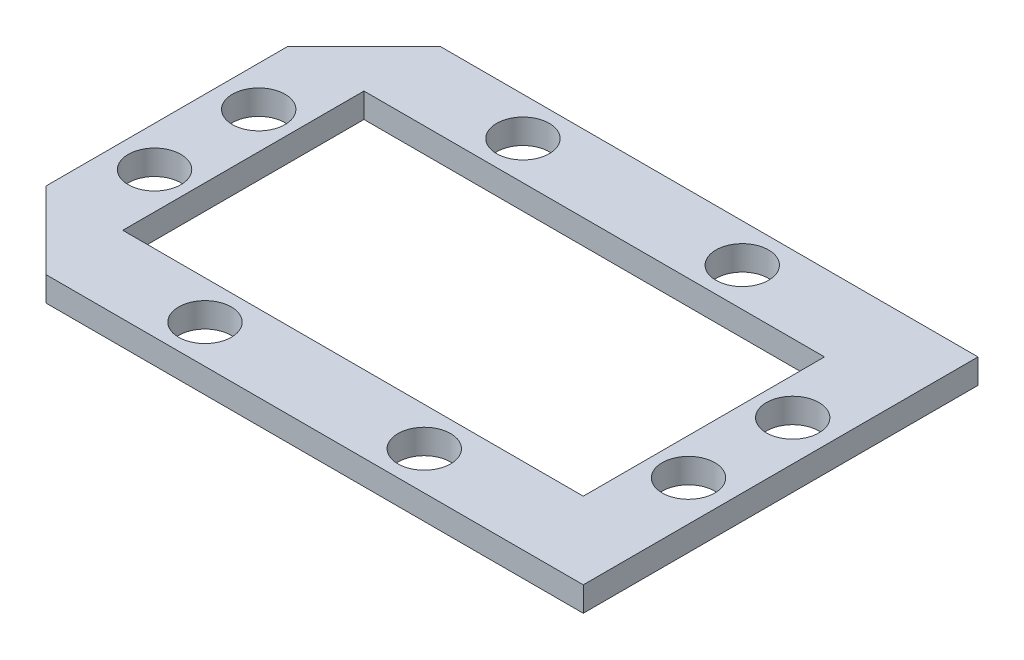
ISO-10303-21;
HEADER;
FILE_DESCRIPTION(('STEP AP214'),'2;1');
FILE_NAME('part.step','',(''),(''),'','','');
FILE_SCHEMA(('AUTOMOTIVE_DESIGN { 1 0 10303 214 1 1 1 1 }'));
ENDSEC;
DATA;
#1=APPLICATION_CONTEXT('core data for automotive mechanical design processes');
#2=APPLICATION_PROTOCOL_DEFINITION('international standard','automotive_design',2000,#1);
#3=PRODUCT_CONTEXT('',#1,'mechanical');
#4=PRODUCT('Part','Part','',(#3));
#5=PRODUCT_RELATED_PRODUCT_CATEGORY('part','',(#4));
#6=PRODUCT_DEFINITION_FORMATION('','',#4);
#7=PRODUCT_DEFINITION_CONTEXT('part definition',#1,'design');
#8=PRODUCT_DEFINITION('design','',#6,#7);
#9=PRODUCT_DEFINITION_SHAPE('','',#8);
#10=(LENGTH_UNIT() NAMED_UNIT(*) SI_UNIT(.MILLI.,.METRE.));
#11=(NAMED_UNIT(*) PLANE_ANGLE_UNIT() SI_UNIT($,.RADIAN.));
#12=(NAMED_UNIT(*) SI_UNIT($,.STERADIAN.) SOLID_ANGLE_UNIT());
#13=UNCERTAINTY_MEASURE_WITH_UNIT(LENGTH_MEASURE(1.E-05),#10,'distance_accuracy_value','');
#14=(GEOMETRIC_REPRESENTATION_CONTEXT(3) GLOBAL_UNCERTAINTY_ASSIGNED_CONTEXT((#13)) GLOBAL_UNIT_ASSIGNED_CONTEXT((#10,
#11,#12)) REPRESENTATION_CONTEXT('',''));
#15=CARTESIAN_POINT('',(0.,0.,0.));
#16=DIRECTION('',(0.,0.,1.));
#17=DIRECTION('',(1.,0.,0.));
#18=AXIS2_PLACEMENT_3D('',#15,#16,#17);
#19=CARTESIAN_POINT('',(0.,2.25,-18.));
#20=DIRECTION('',(0.,0.,-1.));
#21=DIRECTION('',(-1.,0.,0.));
#22=AXIS2_PLACEMENT_3D('',#19,#20,#21);
#23=PLANE('',#22);
#24=DIRECTION('',(1.,0.,0.));
#25=VECTOR('',#24,1.);
#26=CARTESIAN_POINT('',(0.,0.,-18.));
#27=LINE('',#26,#25);
#28=CARTESIAN_POINT('',(-21.,0.,-18.));
#29=VERTEX_POINT('',#28);
#30=CARTESIAN_POINT('',(28.,0.,-18.));
#31=VERTEX_POINT('',#30);
#32=EDGE_CURVE('E136',#29,#31,#27,.T.);
#33=ORIENTED_EDGE('',*,*,#32,.F.);
#34=DIRECTION('',(0.,1.,0.));
#35=VECTOR('',#34,1.);
#36=CARTESIAN_POINT('',(-21.,0.,-18.));
#37=LINE('',#36,#35);
#38=CARTESIAN_POINT('',(-21.,2.25,-18.));
#39=VERTEX_POINT('',#38);
#40=EDGE_CURVE('E60',#29,#39,#37,.T.);
#41=ORIENTED_EDGE('',*,*,#40,.T.);
#42=DIRECTION('',(1.,0.,0.));
#43=VECTOR('',#42,1.);
#44=CARTESIAN_POINT('',(0.,2.25,-18.));
#45=LINE('',#44,#43);
#46=CARTESIAN_POINT('',(28.,2.25,-18.));
#47=VERTEX_POINT('',#46);
#48=EDGE_CURVE('E257',#39,#47,#45,.T.);
#49=ORIENTED_EDGE('',*,*,#48,.T.);
#50=DIRECTION('',(0.,-1.,0.));
#51=VECTOR('',#50,1.);
#52=CARTESIAN_POINT('',(28.,2.25,-18.));
#53=LINE('',#52,#51);
#54=EDGE_CURVE('E11',#47,#31,#53,.T.);
#55=ORIENTED_EDGE('',*,*,#54,.T.);
#56=EDGE_LOOP('',(#33,#41,#49,#55));
#57=FACE_BOUND('',#56,.T.);
#58=ADVANCED_FACE('F37',(#57),#23,.T.);
#59=CARTESIAN_POINT('',(-28.,2.25,0.));
#60=DIRECTION('',(1.,0.,0.));
#61=DIRECTION('',(0.,0.,-1.));
#62=AXIS2_PLACEMENT_3D('',#59,#60,#61);
#63=PLANE('',#62);
#64=DIRECTION('',(0.,1.,0.));
#65=VECTOR('',#64,1.);
#66=CARTESIAN_POINT('',(-28.,0.,-11.));
#67=LINE('',#66,#65);
#68=CARTESIAN_POINT('',(-28.,0.,-11.));
#69=VERTEX_POINT('',#68);
#70=CARTESIAN_POINT('',(-28.,2.25,-11.));
#71=VERTEX_POINT('',#70);
#72=EDGE_CURVE('E116',#69,#71,#67,.T.);
#73=ORIENTED_EDGE('',*,*,#72,.F.);
#74=DIRECTION('',(0.,0.,1.));
#75=VECTOR('',#74,1.);
#76=CARTESIAN_POINT('',(-28.,0.,0.));
#77=LINE('',#76,#75);
#78=CARTESIAN_POINT('',(-28.,0.,11.));
#79=VERTEX_POINT('',#78);
#80=EDGE_CURVE('E128',#69,#79,#77,.T.);
#81=ORIENTED_EDGE('',*,*,#80,.T.);
#82=DIRECTION('',(0.,1.,0.));
#83=VECTOR('',#82,1.);
#84=CARTESIAN_POINT('',(-28.,0.,11.));
#85=LINE('',#84,#83);
#86=CARTESIAN_POINT('',(-28.,2.25,11.));
#87=VERTEX_POINT('',#86);
#88=EDGE_CURVE('E63',#79,#87,#85,.T.);
#89=ORIENTED_EDGE('',*,*,#88,.T.);
#90=DIRECTION('',(0.,0.,1.));
#91=VECTOR('',#90,1.);
#92=CARTESIAN_POINT('',(-28.,2.25,0.));
#93=LINE('',#92,#91);
#94=EDGE_CURVE('E135',#71,#87,#93,.T.);
#95=ORIENTED_EDGE('',*,*,#94,.F.);
#96=EDGE_LOOP('',(#73,#81,#89,#95));
#97=FACE_BOUND('',#96,.T.);
#98=ADVANCED_FACE('F129',(#97),#63,.F.);
#99=CARTESIAN_POINT('',(0.,2.25,18.));
#100=DIRECTION('',(0.,0.,-1.));
#101=DIRECTION('',(-1.,0.,0.));
#102=AXIS2_PLACEMENT_3D('',#99,#100,#101);
#103=PLANE('',#102);
#104=DIRECTION('',(0.,1.,0.));
#105=VECTOR('',#104,1.);
#106=CARTESIAN_POINT('',(-21.,0.,18.));
#107=LINE('',#106,#105);
#108=CARTESIAN_POINT('',(-21.,0.,18.));
#109=VERTEX_POINT('',#108);
#110=CARTESIAN_POINT('',(-21.,2.25,18.));
#111=VERTEX_POINT('',#110);
#112=EDGE_CURVE('E219',#109,#111,#107,.T.);
#113=ORIENTED_EDGE('',*,*,#112,.F.);
#114=DIRECTION('',(1.,0.,0.));
#115=VECTOR('',#114,1.);
#116=CARTESIAN_POINT('',(0.,0.,18.));
#117=LINE('',#116,#115);
#118=CARTESIAN_POINT('',(28.,0.,18.));
#119=VERTEX_POINT('',#118);
#120=EDGE_CURVE('E140',#109,#119,#117,.T.);
#121=ORIENTED_EDGE('',*,*,#120,.T.);
#122=DIRECTION('',(0.,-1.,0.));
#123=VECTOR('',#122,1.);
#124=CARTESIAN_POINT('',(28.,2.25,18.));
#125=LINE('',#124,#123);
#126=CARTESIAN_POINT('',(28.,2.25,18.));
#127=VERTEX_POINT('',#126);
#128=EDGE_CURVE('E47',#127,#119,#125,.T.);
#129=ORIENTED_EDGE('',*,*,#128,.F.);
#130=DIRECTION('',(1.,0.,0.));
#131=VECTOR('',#130,1.);
#132=CARTESIAN_POINT('',(0.,2.25,18.));
#133=LINE('',#132,#131);
#134=EDGE_CURVE('E151',#111,#127,#133,.T.);
#135=ORIENTED_EDGE('',*,*,#134,.F.);
#136=EDGE_LOOP('',(#113,#121,#129,#135));
#137=FACE_BOUND('',#136,.T.);
#138=ADVANCED_FACE('F218',(#137),#103,.F.);
#139=CARTESIAN_POINT('',(28.,2.25,0.));
#140=DIRECTION('',(1.,0.,0.));
#141=DIRECTION('',(0.,0.,-1.));
#142=AXIS2_PLACEMENT_3D('',#139,#140,#141);
#143=PLANE('',#142);
#144=DIRECTION('',(0.,0.,1.));
#145=VECTOR('',#144,1.);
#146=CARTESIAN_POINT('',(28.,0.,0.));
#147=LINE('',#146,#145);
#148=EDGE_CURVE('E142',#31,#119,#147,.T.);
#149=ORIENTED_EDGE('',*,*,#148,.F.);
#150=ORIENTED_EDGE('',*,*,#54,.F.);
#151=DIRECTION('',(0.,0.,1.));
#152=VECTOR('',#151,1.);
#153=CARTESIAN_POINT('',(28.,2.25,0.));
#154=LINE('',#153,#152);
#155=EDGE_CURVE('E214',#47,#127,#154,.T.);
#156=ORIENTED_EDGE('',*,*,#155,.T.);
#157=ORIENTED_EDGE('',*,*,#128,.T.);
#158=EDGE_LOOP('',(#149,#150,#156,#157));
#159=FACE_BOUND('',#158,.T.);
#160=ADVANCED_FACE('F211',(#159),#143,.T.);
#161=CARTESIAN_POINT('',(-21.,2.25,0.));
#162=DIRECTION('',(1.,0.,0.));
#163=DIRECTION('',(0.,0.,-1.));
#164=AXIS2_PLACEMENT_3D('',#161,#162,#163);
#165=PLANE('',#164);
#166=DIRECTION('',(0.,0.,1.));
#167=VECTOR('',#166,1.);
#168=CARTESIAN_POINT('',(-21.,0.,0.));
#169=LINE('',#168,#167);
#170=CARTESIAN_POINT('',(-21.,0.,-11.));
#171=VERTEX_POINT('',#170);
#172=CARTESIAN_POINT('',(-21.,0.,11.));
#173=VERTEX_POINT('',#172);
#174=EDGE_CURVE('E174',#171,#173,#169,.T.);
#175=ORIENTED_EDGE('',*,*,#174,.F.);
#176=DIRECTION('',(0.,-1.,0.));
#177=VECTOR('',#176,1.);
#178=CARTESIAN_POINT('',(-21.,2.25,-11.));
#179=LINE('',#178,#177);
#180=CARTESIAN_POINT('',(-21.,2.25,-11.));
#181=VERTEX_POINT('',#180);
#182=EDGE_CURVE('E42',#181,#171,#179,.T.);
#183=ORIENTED_EDGE('',*,*,#182,.F.);
#184=DIRECTION('',(0.,0.,1.));
#185=VECTOR('',#184,1.);
#186=CARTESIAN_POINT('',(-21.,2.25,0.));
#187=LINE('',#186,#185);
#188=CARTESIAN_POINT('',(-21.,2.25,11.));
#189=VERTEX_POINT('',#188);
#190=EDGE_CURVE('E228',#181,#189,#187,.T.);
#191=ORIENTED_EDGE('',*,*,#190,.T.);
#192=DIRECTION('',(0.,-1.,0.));
#193=VECTOR('',#192,1.);
#194=CARTESIAN_POINT('',(-21.,2.25,11.));
#195=LINE('',#194,#193);
#196=EDGE_CURVE('E146',#189,#173,#195,.T.);
#197=ORIENTED_EDGE('',*,*,#196,.T.);
#198=EDGE_LOOP('',(#175,#183,#191,#197));
#199=FACE_BOUND('',#198,.T.);
#200=ADVANCED_FACE('F180',(#199),#165,.T.);
#201=CARTESIAN_POINT('',(0.,2.25,-11.));
#202=DIRECTION('',(0.,0.,-1.));
#203=DIRECTION('',(-1.,0.,0.));
#204=AXIS2_PLACEMENT_3D('',#201,#202,#203);
#205=PLANE('',#204);
#206=DIRECTION('',(1.,0.,0.));
#207=VECTOR('',#206,1.);
#208=CARTESIAN_POINT('',(0.,0.,-11.));
#209=LINE('',#208,#207);
#210=CARTESIAN_POINT('',(21.,0.,-11.));
#211=VERTEX_POINT('',#210);
#212=EDGE_CURVE('E165',#171,#211,#209,.T.);
#213=ORIENTED_EDGE('',*,*,#212,.T.);
#214=DIRECTION('',(0.,-1.,0.));
#215=VECTOR('',#214,1.);
#216=CARTESIAN_POINT('',(21.,2.25,-11.));
#217=LINE('',#216,#215);
#218=CARTESIAN_POINT('',(21.,2.25,-11.));
#219=VERTEX_POINT('',#218);
#220=EDGE_CURVE('E155',#219,#211,#217,.T.);
#221=ORIENTED_EDGE('',*,*,#220,.F.);
#222=DIRECTION('',(1.,0.,0.));
#223=VECTOR('',#222,1.);
#224=CARTESIAN_POINT('',(0.,2.25,-11.));
#225=LINE('',#224,#223);
#226=EDGE_CURVE('E163',#181,#219,#225,.T.);
#227=ORIENTED_EDGE('',*,*,#226,.F.);
#228=ORIENTED_EDGE('',*,*,#182,.T.);
#229=EDGE_LOOP('',(#213,#221,#227,#228));
#230=FACE_BOUND('',#229,.T.);
#231=ADVANCED_FACE('F161',(#230),#205,.F.);
#232=CARTESIAN_POINT('',(21.,2.25,0.));
#233=DIRECTION('',(1.,0.,0.));
#234=DIRECTION('',(0.,0.,-1.));
#235=AXIS2_PLACEMENT_3D('',#232,#233,#234);
#236=PLANE('',#235);
#237=DIRECTION('',(0.,0.,1.));
#238=VECTOR('',#237,1.);
#239=CARTESIAN_POINT('',(21.,0.,0.));
#240=LINE('',#239,#238);
#241=CARTESIAN_POINT('',(21.,0.,11.));
#242=VERTEX_POINT('',#241);
#243=EDGE_CURVE('E173',#211,#242,#240,.T.);
#244=ORIENTED_EDGE('',*,*,#243,.T.);
#245=DIRECTION('',(0.,-1.,0.));
#246=VECTOR('',#245,1.);
#247=CARTESIAN_POINT('',(21.,2.25,11.));
#248=LINE('',#247,#246);
#249=CARTESIAN_POINT('',(21.,2.25,11.));
#250=VERTEX_POINT('',#249);
#251=EDGE_CURVE('E147',#250,#242,#248,.T.);
#252=ORIENTED_EDGE('',*,*,#251,.F.);
#253=DIRECTION('',(0.,0.,1.));
#254=VECTOR('',#253,1.);
#255=CARTESIAN_POINT('',(21.,2.25,0.));
#256=LINE('',#255,#254);
#257=EDGE_CURVE('E233',#219,#250,#256,.T.);
#258=ORIENTED_EDGE('',*,*,#257,.F.);
#259=ORIENTED_EDGE('',*,*,#220,.T.);
#260=EDGE_LOOP('',(#244,#252,#258,#259));
#261=FACE_BOUND('',#260,.T.);
#262=ADVANCED_FACE('F291',(#261),#236,.F.);
#263=CARTESIAN_POINT('',(-24.35,2.25,-4.75));
#264=DIRECTION('',(0.,-1.,0.));
#265=DIRECTION('',(0.,0.,-1.));
#266=AXIS2_PLACEMENT_3D('',#263,#264,#265);
#267=CYLINDRICAL_SURFACE('',#266,2.4);
#268=CARTESIAN_POINT('',(-24.35,2.25,-4.75));
#269=DIRECTION('',(0.,1.,0.));
#270=DIRECTION('',(0.,0.,1.));
#271=AXIS2_PLACEMENT_3D('',#268,#269,#270);
#272=CIRCLE('',#271,2.4);
#273=CARTESIAN_POINT('',(-24.35,2.25,-2.35));
#274=VERTEX_POINT('',#273);
#275=EDGE_CURVE('E258',#274,#274,#272,.T.);
#276=ORIENTED_EDGE('',*,*,#275,.T.);
#277=EDGE_LOOP('',(#276));
#278=FACE_BOUND('',#277,.T.);
#279=CARTESIAN_POINT('',(-24.35,0.,-4.75));
#280=DIRECTION('',(0.,1.,0.));
#281=DIRECTION('',(0.,0.,1.));
#282=AXIS2_PLACEMENT_3D('',#279,#280,#281);
#283=CIRCLE('',#282,2.4);
#284=CARTESIAN_POINT('',(-24.35,0.,-2.35));
#285=VERTEX_POINT('',#284);
#286=EDGE_CURVE('E202',#285,#285,#283,.T.);
#287=ORIENTED_EDGE('',*,*,#286,.F.);
#288=EDGE_LOOP('',(#287));
#289=FACE_BOUND('',#288,.T.);
#290=ADVANCED_FACE('F289',(#278,#289),#267,.F.);
#291=CARTESIAN_POINT('',(-24.35,2.25,4.75000000000001));
#292=DIRECTION('',(0.,-1.,0.));
#293=DIRECTION('',(0.,0.,-1.));
#294=AXIS2_PLACEMENT_3D('',#291,#292,#293);
#295=CYLINDRICAL_SURFACE('',#294,2.4);
#296=CARTESIAN_POINT('',(-24.35,2.25,4.75000000000001));
#297=DIRECTION('',(0.,1.,0.));
#298=DIRECTION('',(0.,0.,1.));
#299=AXIS2_PLACEMENT_3D('',#296,#297,#298);
#300=CIRCLE('',#299,2.4);
#301=CARTESIAN_POINT('',(-24.35,2.25,7.15000000000001));
#302=VERTEX_POINT('',#301);
#303=EDGE_CURVE('E251',#302,#302,#300,.T.);
#304=ORIENTED_EDGE('',*,*,#303,.T.);
#305=EDGE_LOOP('',(#304));
#306=FACE_BOUND('',#305,.T.);
#307=CARTESIAN_POINT('',(-24.35,0.,4.75000000000001));
#308=DIRECTION('',(0.,1.,0.));
#309=DIRECTION('',(0.,0.,1.));
#310=AXIS2_PLACEMENT_3D('',#307,#308,#309);
#311=CIRCLE('',#310,2.4);
#312=CARTESIAN_POINT('',(-24.35,0.,7.15000000000001));
#313=VERTEX_POINT('',#312);
#314=EDGE_CURVE('E205',#313,#313,#311,.T.);
#315=ORIENTED_EDGE('',*,*,#314,.F.);
#316=EDGE_LOOP('',(#315));
#317=FACE_BOUND('',#316,.T.);
#318=ADVANCED_FACE('F295',(#306,#317),#295,.F.);
#319=CARTESIAN_POINT('',(-10.,2.25,14.5));
#320=DIRECTION('',(0.,-1.,0.));
#321=DIRECTION('',(0.,0.,-1.));
#322=AXIS2_PLACEMENT_3D('',#319,#320,#321);
#323=CYLINDRICAL_SURFACE('',#322,2.4);
#324=CARTESIAN_POINT('',(-10.,2.25,14.5));
#325=DIRECTION('',(0.,1.,0.));
#326=DIRECTION('',(0.,0.,1.));
#327=AXIS2_PLACEMENT_3D('',#324,#325,#326);
#328=CIRCLE('',#327,2.4);
#329=CARTESIAN_POINT('',(-10.,2.25,16.9));
#330=VERTEX_POINT('',#329);
#331=EDGE_CURVE('E249',#330,#330,#328,.T.);
#332=ORIENTED_EDGE('',*,*,#331,.T.);
#333=EDGE_LOOP('',(#332));
#334=FACE_BOUND('',#333,.T.);
#335=CARTESIAN_POINT('',(-10.,0.,14.5));
#336=DIRECTION('',(0.,1.,0.));
#337=DIRECTION('',(0.,0.,1.));
#338=AXIS2_PLACEMENT_3D('',#335,#336,#337);
#339=CIRCLE('',#338,2.4);
#340=CARTESIAN_POINT('',(-10.,0.,16.9));
#341=VERTEX_POINT('',#340);
#342=EDGE_CURVE('E200',#341,#341,#339,.T.);
#343=ORIENTED_EDGE('',*,*,#342,.F.);
#344=EDGE_LOOP('',(#343));
#345=FACE_BOUND('',#344,.T.);
#346=ADVANCED_FACE('F300',(#334,#345),#323,.F.);
#347=CARTESIAN_POINT('',(-10.,2.25,-14.5));
#348=DIRECTION('',(0.,-1.,0.));
#349=DIRECTION('',(0.,0.,-1.));
#350=AXIS2_PLACEMENT_3D('',#347,#348,#349);
#351=CYLINDRICAL_SURFACE('',#350,2.4);
#352=CARTESIAN_POINT('',(-10.,2.25,-14.5));
#353=DIRECTION('',(0.,1.,0.));
#354=DIRECTION('',(0.,0.,1.));
#355=AXIS2_PLACEMENT_3D('',#352,#353,#354);
#356=CIRCLE('',#355,2.4);
#357=CARTESIAN_POINT('',(-10.,2.25,-12.1));
#358=VERTEX_POINT('',#357);
#359=EDGE_CURVE('E250',#358,#358,#356,.T.);
#360=ORIENTED_EDGE('',*,*,#359,.T.);
#361=EDGE_LOOP('',(#360));
#362=FACE_BOUND('',#361,.T.);
#363=CARTESIAN_POINT('',(-10.,0.,-14.5));
#364=DIRECTION('',(0.,1.,0.));
#365=DIRECTION('',(0.,0.,1.));
#366=AXIS2_PLACEMENT_3D('',#363,#364,#365);
#367=CIRCLE('',#366,2.4);
#368=CARTESIAN_POINT('',(-10.,0.,-12.1));
#369=VERTEX_POINT('',#368);
#370=EDGE_CURVE('E198',#369,#369,#367,.T.);
#371=ORIENTED_EDGE('',*,*,#370,.F.);
#372=EDGE_LOOP('',(#371));
#373=FACE_BOUND('',#372,.T.);
#374=ADVANCED_FACE('F303',(#362,#373),#351,.F.);
#375=CARTESIAN_POINT('',(10.,2.25,14.5));
#376=DIRECTION('',(0.,-1.,0.));
#377=DIRECTION('',(0.,0.,-1.));
#378=AXIS2_PLACEMENT_3D('',#375,#376,#377);
#379=CYLINDRICAL_SURFACE('',#378,2.4);
#380=CARTESIAN_POINT('',(10.,2.25,14.5));
#381=DIRECTION('',(0.,1.,0.));
#382=DIRECTION('',(0.,0.,1.));
#383=AXIS2_PLACEMENT_3D('',#380,#381,#382);
#384=CIRCLE('',#383,2.4);
#385=CARTESIAN_POINT('',(10.,2.25,16.9));
#386=VERTEX_POINT('',#385);
#387=EDGE_CURVE('E241',#386,#386,#384,.T.);
#388=ORIENTED_EDGE('',*,*,#387,.T.);
#389=EDGE_LOOP('',(#388));
#390=FACE_BOUND('',#389,.T.);
#391=CARTESIAN_POINT('',(10.,0.,14.5));
#392=DIRECTION('',(0.,1.,0.));
#393=DIRECTION('',(0.,0.,1.));
#394=AXIS2_PLACEMENT_3D('',#391,#392,#393);
#395=CIRCLE('',#394,2.4);
#396=CARTESIAN_POINT('',(10.,0.,16.9));
#397=VERTEX_POINT('',#396);
#398=EDGE_CURVE('E191',#397,#397,#395,.T.);
#399=ORIENTED_EDGE('',*,*,#398,.F.);
#400=EDGE_LOOP('',(#399));
#401=FACE_BOUND('',#400,.T.);
#402=ADVANCED_FACE('F304',(#390,#401),#379,.F.);
#403=CARTESIAN_POINT('',(24.35,2.25,4.75));
#404=DIRECTION('',(0.,-1.,0.));
#405=DIRECTION('',(0.,0.,-1.));
#406=AXIS2_PLACEMENT_3D('',#403,#404,#405);
#407=CYLINDRICAL_SURFACE('',#406,2.4);
#408=CARTESIAN_POINT('',(24.35,2.25,4.75));
#409=DIRECTION('',(0.,1.,0.));
#410=DIRECTION('',(0.,0.,1.));
#411=AXIS2_PLACEMENT_3D('',#408,#409,#410);
#412=CIRCLE('',#411,2.4);
#413=CARTESIAN_POINT('',(24.35,2.25,7.15000000000001));
#414=VERTEX_POINT('',#413);
#415=EDGE_CURVE('E242',#414,#414,#412,.T.);
#416=ORIENTED_EDGE('',*,*,#415,.T.);
#417=EDGE_LOOP('',(#416));
#418=FACE_BOUND('',#417,.T.);
#419=CARTESIAN_POINT('',(24.35,0.,4.75));
#420=DIRECTION('',(0.,1.,0.));
#421=DIRECTION('',(0.,0.,1.));
#422=AXIS2_PLACEMENT_3D('',#419,#420,#421);
#423=CIRCLE('',#422,2.4);
#424=CARTESIAN_POINT('',(24.35,0.,7.15000000000001));
#425=VERTEX_POINT('',#424);
#426=EDGE_CURVE('E188',#425,#425,#423,.T.);
#427=ORIENTED_EDGE('',*,*,#426,.F.);
#428=EDGE_LOOP('',(#427));
#429=FACE_BOUND('',#428,.T.);
#430=ADVANCED_FACE('F310',(#418,#429),#407,.F.);
#431=CARTESIAN_POINT('',(24.35,2.25,-4.75));
#432=DIRECTION('',(0.,-1.,0.));
#433=DIRECTION('',(0.,0.,-1.));
#434=AXIS2_PLACEMENT_3D('',#431,#432,#433);
#435=CYLINDRICAL_SURFACE('',#434,2.4);
#436=CARTESIAN_POINT('',(24.35,2.25,-4.75));
#437=DIRECTION('',(0.,1.,0.));
#438=DIRECTION('',(0.,0.,1.));
#439=AXIS2_PLACEMENT_3D('',#436,#437,#438);
#440=CIRCLE('',#439,2.4);
#441=CARTESIAN_POINT('',(24.35,2.25,-2.35));
#442=VERTEX_POINT('',#441);
#443=EDGE_CURVE('E236',#442,#442,#440,.T.);
#444=ORIENTED_EDGE('',*,*,#443,.T.);
#445=EDGE_LOOP('',(#444));
#446=FACE_BOUND('',#445,.T.);
#447=CARTESIAN_POINT('',(24.35,0.,-4.75));
#448=DIRECTION('',(0.,1.,0.));
#449=DIRECTION('',(0.,0.,1.));
#450=AXIS2_PLACEMENT_3D('',#447,#448,#449);
#451=CIRCLE('',#450,2.4);
#452=CARTESIAN_POINT('',(24.35,0.,-2.35));
#453=VERTEX_POINT('',#452);
#454=EDGE_CURVE('E190',#453,#453,#451,.T.);
#455=ORIENTED_EDGE('',*,*,#454,.F.);
#456=EDGE_LOOP('',(#455));
#457=FACE_BOUND('',#456,.T.);
#458=ADVANCED_FACE('F311',(#446,#457),#435,.F.);
#459=CARTESIAN_POINT('',(0.,2.25,11.));
#460=DIRECTION('',(0.,0.,-1.));
#461=DIRECTION('',(-1.,0.,0.));
#462=AXIS2_PLACEMENT_3D('',#459,#460,#461);
#463=PLANE('',#462);
#464=DIRECTION('',(1.,0.,0.));
#465=VECTOR('',#464,1.);
#466=CARTESIAN_POINT('',(0.,0.,11.));
#467=LINE('',#466,#465);
#468=EDGE_CURVE('E183',#173,#242,#467,.T.);
#469=ORIENTED_EDGE('',*,*,#468,.F.);
#470=ORIENTED_EDGE('',*,*,#196,.F.);
#471=DIRECTION('',(1.,0.,0.));
#472=VECTOR('',#471,1.);
#473=CARTESIAN_POINT('',(0.,2.25,11.));
#474=LINE('',#473,#472);
#475=EDGE_CURVE('E231',#189,#250,#474,.T.);
#476=ORIENTED_EDGE('',*,*,#475,.T.);
#477=ORIENTED_EDGE('',*,*,#251,.T.);
#478=EDGE_LOOP('',(#469,#470,#476,#477));
#479=FACE_BOUND('',#478,.T.);
#480=ADVANCED_FACE('F320',(#479),#463,.T.);
#481=CARTESIAN_POINT('',(10.,2.25,-14.5));
#482=DIRECTION('',(0.,-1.,0.));
#483=DIRECTION('',(0.,0.,-1.));
#484=AXIS2_PLACEMENT_3D('',#481,#482,#483);
#485=CYLINDRICAL_SURFACE('',#484,2.4);
#486=CARTESIAN_POINT('',(10.,2.25,-14.5));
#487=DIRECTION('',(0.,1.,0.));
#488=DIRECTION('',(0.,0.,1.));
#489=AXIS2_PLACEMENT_3D('',#486,#487,#488);
#490=CIRCLE('',#489,2.4);
#491=CARTESIAN_POINT('',(10.,2.25,-12.1));
#492=VERTEX_POINT('',#491);
#493=EDGE_CURVE('E139',#492,#492,#490,.T.);
#494=ORIENTED_EDGE('',*,*,#493,.T.);
#495=EDGE_LOOP('',(#494));
#496=FACE_BOUND('',#495,.T.);
#497=CARTESIAN_POINT('',(10.,0.,-14.5));
#498=DIRECTION('',(0.,1.,0.));
#499=DIRECTION('',(0.,0.,1.));
#500=AXIS2_PLACEMENT_3D('',#497,#498,#499);
#501=CIRCLE('',#500,2.4);
#502=CARTESIAN_POINT('',(10.,0.,-12.1));
#503=VERTEX_POINT('',#502);
#504=EDGE_CURVE('E178',#503,#503,#501,.T.);
#505=ORIENTED_EDGE('',*,*,#504,.F.);
#506=EDGE_LOOP('',(#505));
#507=FACE_BOUND('',#506,.T.);
#508=ADVANCED_FACE('F45',(#496,#507),#485,.F.);
#509=CARTESIAN_POINT('',(0.,2.25,0.));
#510=DIRECTION('',(0.,1.,0.));
#511=DIRECTION('',(0.,0.,1.));
#512=AXIS2_PLACEMENT_3D('',#509,#510,#511);
#513=PLANE('',#512);
#514=DIRECTION('',(0.707106781186548,0.,-0.707106781186548));
#515=VECTOR('',#514,1.);
#516=CARTESIAN_POINT('',(-19.5,2.25,-19.5));
#517=LINE('',#516,#515);
#518=EDGE_CURVE('E124',#71,#39,#517,.T.);
#519=ORIENTED_EDGE('',*,*,#518,.F.);
#520=ORIENTED_EDGE('',*,*,#94,.T.);
#521=DIRECTION('',(-0.707106781186549,0.,-0.707106781186546));
#522=VECTOR('',#521,1.);
#523=CARTESIAN_POINT('',(-19.5,2.25,19.5));
#524=LINE('',#523,#522);
#525=EDGE_CURVE('E221',#111,#87,#524,.T.);
#526=ORIENTED_EDGE('',*,*,#525,.F.);
#527=ORIENTED_EDGE('',*,*,#134,.T.);
#528=ORIENTED_EDGE('',*,*,#155,.F.);
#529=ORIENTED_EDGE('',*,*,#48,.F.);
#530=EDGE_LOOP('',(#519,#520,#526,#527,#528,#529));
#531=FACE_BOUND('',#530,.T.);
#532=ORIENTED_EDGE('',*,*,#493,.F.);
#533=EDGE_LOOP('',(#532));
#534=FACE_BOUND('',#533,.T.);
#535=ORIENTED_EDGE('',*,*,#190,.F.);
#536=ORIENTED_EDGE('',*,*,#226,.T.);
#537=ORIENTED_EDGE('',*,*,#257,.T.);
#538=ORIENTED_EDGE('',*,*,#475,.F.);
#539=EDGE_LOOP('',(#535,#536,#537,#538));
#540=FACE_BOUND('',#539,.T.);
#541=ORIENTED_EDGE('',*,*,#443,.F.);
#542=EDGE_LOOP('',(#541));
#543=FACE_BOUND('',#542,.T.);
#544=ORIENTED_EDGE('',*,*,#415,.F.);
#545=EDGE_LOOP('',(#544));
#546=FACE_BOUND('',#545,.T.);
#547=ORIENTED_EDGE('',*,*,#387,.F.);
#548=EDGE_LOOP('',(#547));
#549=FACE_BOUND('',#548,.T.);
#550=ORIENTED_EDGE('',*,*,#359,.F.);
#551=EDGE_LOOP('',(#550));
#552=FACE_BOUND('',#551,.T.);
#553=ORIENTED_EDGE('',*,*,#331,.F.);
#554=EDGE_LOOP('',(#553));
#555=FACE_BOUND('',#554,.T.);
#556=ORIENTED_EDGE('',*,*,#303,.F.);
#557=EDGE_LOOP('',(#556));
#558=FACE_BOUND('',#557,.T.);
#559=ORIENTED_EDGE('',*,*,#275,.F.);
#560=EDGE_LOOP('',(#559));
#561=FACE_BOUND('',#560,.T.);
#562=ADVANCED_FACE('F263',(#531,#534,#540,#543,#546,#549,#552,#555,#558,#561),#513,.T.);
#563=CARTESIAN_POINT('',(0.,0.,0.));
#564=DIRECTION('',(0.,1.,0.));
#565=DIRECTION('',(0.,0.,1.));
#566=AXIS2_PLACEMENT_3D('',#563,#564,#565);
#567=PLANE('',#566);
#568=ORIENTED_EDGE('',*,*,#504,.T.);
#569=EDGE_LOOP('',(#568));
#570=FACE_BOUND('',#569,.T.);
#571=ORIENTED_EDGE('',*,*,#174,.T.);
#572=ORIENTED_EDGE('',*,*,#468,.T.);
#573=ORIENTED_EDGE('',*,*,#243,.F.);
#574=ORIENTED_EDGE('',*,*,#212,.F.);
#575=EDGE_LOOP('',(#571,#572,#573,#574));
#576=FACE_BOUND('',#575,.T.);
#577=ORIENTED_EDGE('',*,*,#454,.T.);
#578=EDGE_LOOP('',(#577));
#579=FACE_BOUND('',#578,.T.);
#580=ORIENTED_EDGE('',*,*,#426,.T.);
#581=EDGE_LOOP('',(#580));
#582=FACE_BOUND('',#581,.T.);
#583=ORIENTED_EDGE('',*,*,#398,.T.);
#584=EDGE_LOOP('',(#583));
#585=FACE_BOUND('',#584,.T.);
#586=ORIENTED_EDGE('',*,*,#370,.T.);
#587=EDGE_LOOP('',(#586));
#588=FACE_BOUND('',#587,.T.);
#589=ORIENTED_EDGE('',*,*,#342,.T.);
#590=EDGE_LOOP('',(#589));
#591=FACE_BOUND('',#590,.T.);
#592=ORIENTED_EDGE('',*,*,#314,.T.);
#593=EDGE_LOOP('',(#592));
#594=FACE_BOUND('',#593,.T.);
#595=ORIENTED_EDGE('',*,*,#286,.T.);
#596=EDGE_LOOP('',(#595));
#597=FACE_BOUND('',#596,.T.);
#598=ORIENTED_EDGE('',*,*,#80,.F.);
#599=DIRECTION('',(0.707106781186548,0.,-0.707106781186548));
#600=VECTOR('',#599,1.);
#601=CARTESIAN_POINT('',(-19.5,0.,-19.5));
#602=LINE('',#601,#600);
#603=EDGE_CURVE('E117',#69,#29,#602,.T.);
#604=ORIENTED_EDGE('',*,*,#603,.T.);
#605=ORIENTED_EDGE('',*,*,#32,.T.);
#606=ORIENTED_EDGE('',*,*,#148,.T.);
#607=ORIENTED_EDGE('',*,*,#120,.F.);
#608=DIRECTION('',(-0.707106781186549,0.,-0.707106781186546));
#609=VECTOR('',#608,1.);
#610=CARTESIAN_POINT('',(-19.5,0.,19.5));
#611=LINE('',#610,#609);
#612=EDGE_CURVE('E138',#109,#79,#611,.T.);
#613=ORIENTED_EDGE('',*,*,#612,.T.);
#614=EDGE_LOOP('',(#598,#604,#605,#606,#607,#613));
#615=FACE_BOUND('',#614,.T.);
#616=ADVANCED_FACE('F131',(#570,#576,#579,#582,#585,#588,#591,#594,#597,#615),#567,.F.);
#617=CARTESIAN_POINT('',(-19.5,0.,19.5));
#618=DIRECTION('',(0.707106781186546,0.,-0.707106781186548));
#619=DIRECTION('',(-0.707106781186549,0.,-0.707106781186546));
#620=AXIS2_PLACEMENT_3D('',#617,#618,#619);
#621=PLANE('',#620);
#622=ORIENTED_EDGE('',*,*,#525,.T.);
#623=ORIENTED_EDGE('',*,*,#88,.F.);
#624=ORIENTED_EDGE('',*,*,#612,.F.);
#625=ORIENTED_EDGE('',*,*,#112,.T.);
#626=EDGE_LOOP('',(#622,#623,#624,#625));
#627=FACE_BOUND('',#626,.T.);
#628=ADVANCED_FACE('F266',(#627),#621,.F.);
#629=CARTESIAN_POINT('',(-19.5,0.,-19.5));
#630=DIRECTION('',(0.707106781186547,0.,0.707106781186547));
#631=DIRECTION('',(0.707106781186548,0.,-0.707106781186548));
#632=AXIS2_PLACEMENT_3D('',#629,#630,#631);
#633=PLANE('',#632);
#634=ORIENTED_EDGE('',*,*,#518,.T.);
#635=ORIENTED_EDGE('',*,*,#40,.F.);
#636=ORIENTED_EDGE('',*,*,#603,.F.);
#637=ORIENTED_EDGE('',*,*,#72,.T.);
#638=EDGE_LOOP('',(#634,#635,#636,#637));
#639=FACE_BOUND('',#638,.T.);
#640=ADVANCED_FACE('F119',(#639),#633,.F.);
#641=CLOSED_SHELL('',(#58,#98,#138,#160,#200,#231,#262,#290,#318,#346,#374,#402,#430,#458,#480,
#508,#562,#616,#628,#640));
#642=MANIFOLD_SOLID_BREP('B2',#641);
#643=ADVANCED_BREP_SHAPE_REPRESENTATION('',(#18,#642),#14);
#644=SHAPE_DEFINITION_REPRESENTATION(#9,#643);
ENDSEC;
END-ISO-10303-21;
